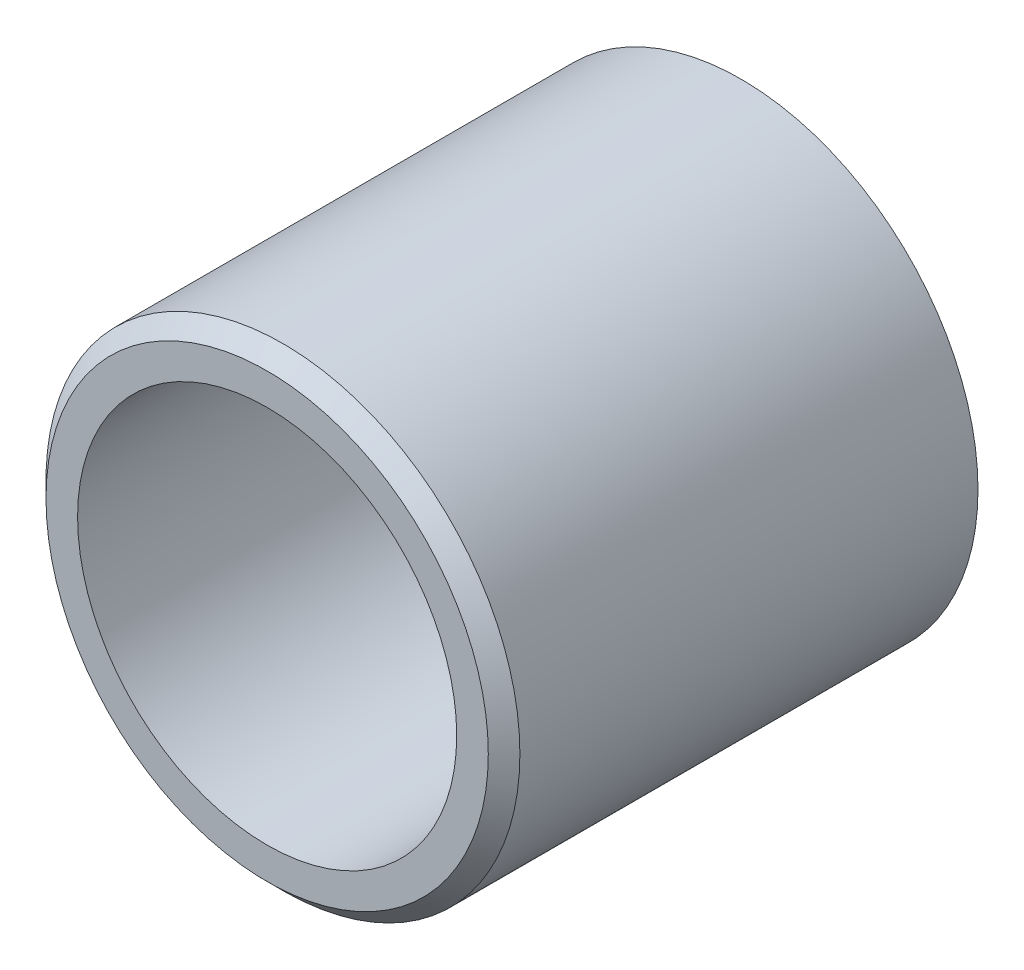
ISO-10303-21;
HEADER;
FILE_DESCRIPTION(('STEP AP214'),'2;1');
FILE_NAME('part.step','',(''),(''),'','','');
FILE_SCHEMA(('AUTOMOTIVE_DESIGN { 1 0 10303 214 1 1 1 1 }'));
ENDSEC;
DATA;
#1=APPLICATION_CONTEXT('core data for automotive mechanical design processes');
#2=APPLICATION_PROTOCOL_DEFINITION('international standard','automotive_design',2000,#1);
#3=PRODUCT_CONTEXT('',#1,'mechanical');
#4=PRODUCT('Part','Part','',(#3));
#5=PRODUCT_RELATED_PRODUCT_CATEGORY('part','',(#4));
#6=PRODUCT_DEFINITION_FORMATION('','',#4);
#7=PRODUCT_DEFINITION_CONTEXT('part definition',#1,'design');
#8=PRODUCT_DEFINITION('design','',#6,#7);
#9=PRODUCT_DEFINITION_SHAPE('','',#8);
#10=(LENGTH_UNIT() NAMED_UNIT(*) SI_UNIT(.MILLI.,.METRE.));
#11=(NAMED_UNIT(*) PLANE_ANGLE_UNIT() SI_UNIT($,.RADIAN.));
#12=(NAMED_UNIT(*) SI_UNIT($,.STERADIAN.) SOLID_ANGLE_UNIT());
#13=UNCERTAINTY_MEASURE_WITH_UNIT(LENGTH_MEASURE(1.E-05),#10,'distance_accuracy_value','');
#14=(GEOMETRIC_REPRESENTATION_CONTEXT(3) GLOBAL_UNCERTAINTY_ASSIGNED_CONTEXT((#13)) GLOBAL_UNIT_ASSIGNED_CONTEXT((#10,
#11,#12)) REPRESENTATION_CONTEXT('',''));
#15=CARTESIAN_POINT('',(0.,0.,0.));
#16=DIRECTION('',(0.,0.,1.));
#17=DIRECTION('',(1.,0.,0.));
#18=AXIS2_PLACEMENT_3D('',#15,#16,#17);
#19=CARTESIAN_POINT('',(0.,0.,15.));
#20=DIRECTION('',(0.,0.,1.));
#21=DIRECTION('',(1.,0.,0.));
#22=AXIS2_PLACEMENT_3D('',#19,#20,#21);
#23=PLANE('',#22);
#24=CARTESIAN_POINT('',(0.,0.,15.));
#25=DIRECTION('',(0.,0.,1.));
#26=DIRECTION('',(1.,0.,0.));
#27=AXIS2_PLACEMENT_3D('',#24,#25,#26);
#28=CIRCLE('',#27,7.);
#29=CARTESIAN_POINT('',(7.,0.,15.));
#30=VERTEX_POINT('',#29);
#31=EDGE_CURVE('E52',#30,#30,#28,.T.);
#32=ORIENTED_EDGE('',*,*,#31,.T.);
#33=EDGE_LOOP('',(#32));
#34=FACE_BOUND('',#33,.T.);
#35=CARTESIAN_POINT('',(0.,0.,15.));
#36=DIRECTION('',(0.,0.,1.));
#37=DIRECTION('',(1.,0.,0.));
#38=AXIS2_PLACEMENT_3D('',#35,#36,#37);
#39=CIRCLE('',#38,6.);
#40=CARTESIAN_POINT('',(6.,0.,15.));
#41=VERTEX_POINT('',#40);
#42=EDGE_CURVE('E62',#41,#41,#39,.T.);
#43=ORIENTED_EDGE('',*,*,#42,.F.);
#44=EDGE_LOOP('',(#43));
#45=FACE_BOUND('',#44,.T.);
#46=ADVANCED_FACE('F43',(#34,#45),#23,.T.);
#47=CARTESIAN_POINT('',(0.,0.,0.));
#48=DIRECTION('',(0.,0.,1.));
#49=DIRECTION('',(1.,0.,0.));
#50=AXIS2_PLACEMENT_3D('',#47,#48,#49);
#51=PLANE('',#50);
#52=CARTESIAN_POINT('',(0.,0.,0.));
#53=DIRECTION('',(0.,0.,1.));
#54=DIRECTION('',(1.,0.,0.));
#55=AXIS2_PLACEMENT_3D('',#52,#53,#54);
#56=CIRCLE('',#55,7.5);
#57=CARTESIAN_POINT('',(7.5,0.,0.));
#58=VERTEX_POINT('',#57);
#59=EDGE_CURVE('E57',#58,#58,#56,.T.);
#60=ORIENTED_EDGE('',*,*,#59,.F.);
#61=EDGE_LOOP('',(#60));
#62=FACE_BOUND('',#61,.T.);
#63=CARTESIAN_POINT('',(0.,0.,0.));
#64=DIRECTION('',(0.,0.,1.));
#65=DIRECTION('',(1.,0.,0.));
#66=AXIS2_PLACEMENT_3D('',#63,#64,#65);
#67=CIRCLE('',#66,6.);
#68=CARTESIAN_POINT('',(6.,0.,0.));
#69=VERTEX_POINT('',#68);
#70=EDGE_CURVE('E65',#69,#69,#67,.T.);
#71=ORIENTED_EDGE('',*,*,#70,.T.);
#72=EDGE_LOOP('',(#71));
#73=FACE_BOUND('',#72,.T.);
#74=ADVANCED_FACE('F77',(#62,#73),#51,.F.);
#75=CARTESIAN_POINT('',(0.,0.,15.));
#76=DIRECTION('',(0.,0.,-1.));
#77=DIRECTION('',(-1.,0.,0.));
#78=AXIS2_PLACEMENT_3D('',#75,#76,#77);
#79=CYLINDRICAL_SURFACE('',#78,7.5);
#80=CARTESIAN_POINT('',(0.,0.,14.5));
#81=DIRECTION('',(0.,0.,1.));
#82=DIRECTION('',(1.,0.,0.));
#83=AXIS2_PLACEMENT_3D('',#80,#81,#82);
#84=CIRCLE('',#83,7.5);
#85=CARTESIAN_POINT('',(7.5,0.,14.5));
#86=VERTEX_POINT('',#85);
#87=EDGE_CURVE('E10',#86,#86,#84,.F.);
#88=ORIENTED_EDGE('',*,*,#87,.T.);
#89=EDGE_LOOP('',(#88));
#90=FACE_BOUND('',#89,.T.);
#91=ORIENTED_EDGE('',*,*,#59,.T.);
#92=EDGE_LOOP('',(#91));
#93=FACE_BOUND('',#92,.T.);
#94=ADVANCED_FACE('F82',(#90,#93),#79,.T.);
#95=CARTESIAN_POINT('',(0.,0.,15.));
#96=DIRECTION('',(0.,0.,-1.));
#97=DIRECTION('',(-1.,0.,0.));
#98=AXIS2_PLACEMENT_3D('',#95,#96,#97);
#99=CYLINDRICAL_SURFACE('',#98,6.);
#100=ORIENTED_EDGE('',*,*,#42,.T.);
#101=EDGE_LOOP('',(#100));
#102=FACE_BOUND('',#101,.T.);
#103=ORIENTED_EDGE('',*,*,#70,.F.);
#104=EDGE_LOOP('',(#103));
#105=FACE_BOUND('',#104,.T.);
#106=ADVANCED_FACE('F73',(#102,#105),#99,.F.);
#107=CARTESIAN_POINT('',(0.,0.,15.));
#108=DIRECTION('',(0.,0.,-1.));
#109=DIRECTION('',(-1.,0.,0.));
#110=AXIS2_PLACEMENT_3D('',#107,#108,#109);
#111=CONICAL_SURFACE('',#110,7.,0.785398163397447);
#112=ORIENTED_EDGE('',*,*,#87,.F.);
#113=EDGE_LOOP('',(#112));
#114=FACE_BOUND('',#113,.T.);
#115=ORIENTED_EDGE('',*,*,#31,.F.);
#116=EDGE_LOOP('',(#115));
#117=FACE_BOUND('',#116,.T.);
#118=ADVANCED_FACE('F46',(#114,#117),#111,.T.);
#119=CLOSED_SHELL('',(#46,#74,#94,#106,#118));
#120=MANIFOLD_SOLID_BREP('B2',#119);
#121=ADVANCED_BREP_SHAPE_REPRESENTATION('',(#18,#120),#14);
#122=SHAPE_DEFINITION_REPRESENTATION(#9,#121);
ENDSEC;
END-ISO-10303-21;
